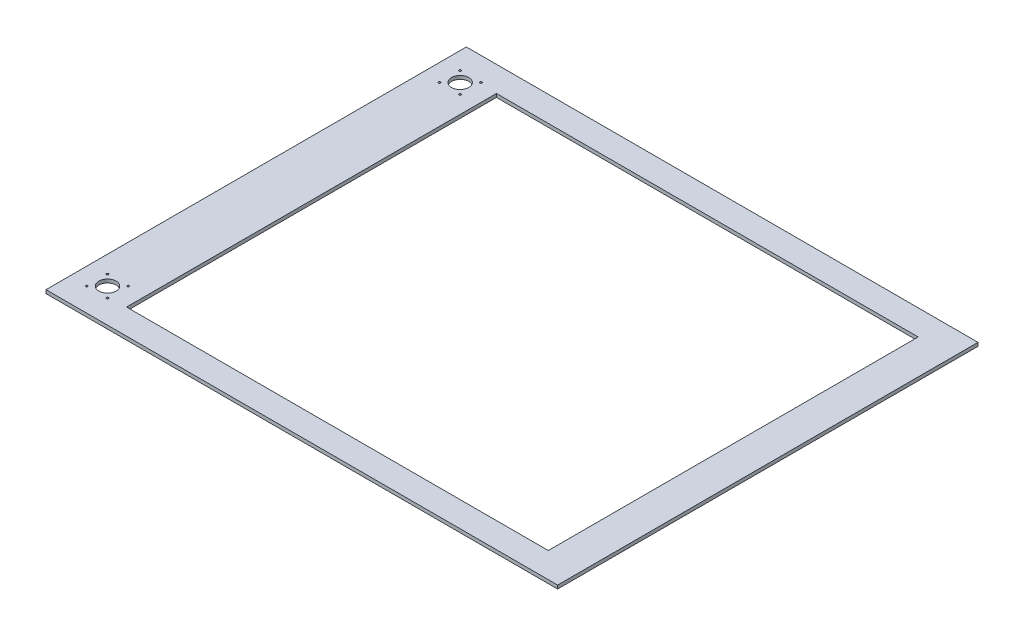
ISO-10303-21;
HEADER;
FILE_DESCRIPTION(('STEP AP214'),'2;1');
FILE_NAME('part.step','',(''),(''),'','','');
FILE_SCHEMA(('AUTOMOTIVE_DESIGN { 1 0 10303 214 1 1 1 1 }'));
ENDSEC;
DATA;
#1=APPLICATION_CONTEXT('core data for automotive mechanical design processes');
#2=APPLICATION_PROTOCOL_DEFINITION('international standard','automotive_design',2000,#1);
#3=PRODUCT_CONTEXT('',#1,'mechanical');
#4=PRODUCT('Part','Part','',(#3));
#5=PRODUCT_RELATED_PRODUCT_CATEGORY('part','',(#4));
#6=PRODUCT_DEFINITION_FORMATION('','',#4);
#7=PRODUCT_DEFINITION_CONTEXT('part definition',#1,'design');
#8=PRODUCT_DEFINITION('design','',#6,#7);
#9=PRODUCT_DEFINITION_SHAPE('','',#8);
#10=(LENGTH_UNIT() NAMED_UNIT(*) SI_UNIT(.MILLI.,.METRE.));
#11=(NAMED_UNIT(*) PLANE_ANGLE_UNIT() SI_UNIT($,.RADIAN.));
#12=(NAMED_UNIT(*) SI_UNIT($,.STERADIAN.) SOLID_ANGLE_UNIT());
#13=UNCERTAINTY_MEASURE_WITH_UNIT(LENGTH_MEASURE(1.E-05),#10,'distance_accuracy_value','');
#14=(GEOMETRIC_REPRESENTATION_CONTEXT(3) GLOBAL_UNCERTAINTY_ASSIGNED_CONTEXT((#13)) GLOBAL_UNIT_ASSIGNED_CONTEXT((#10,
#11,#12)) REPRESENTATION_CONTEXT('',''));
#15=CARTESIAN_POINT('',(0.,0.,0.));
#16=DIRECTION('',(0.,0.,1.));
#17=DIRECTION('',(1.,0.,0.));
#18=AXIS2_PLACEMENT_3D('',#15,#16,#17);
#19=CARTESIAN_POINT('',(0.,5.,0.));
#20=DIRECTION('',(0.,-1.,0.));
#21=DIRECTION('',(0.,0.,-1.));
#22=AXIS2_PLACEMENT_3D('',#19,#20,#21);
#23=PLANE('',#22);
#24=DIRECTION('',(0.,0.,1.));
#25=VECTOR('',#24,1.);
#26=CARTESIAN_POINT('',(0.,5.,0.));
#27=LINE('',#26,#25);
#28=CARTESIAN_POINT('',(-2.22044604925031E-13,5.,-608.));
#29=VERTEX_POINT('',#28);
#30=CARTESIAN_POINT('',(0.,5.,0.));
#31=VERTEX_POINT('',#30);
#32=EDGE_CURVE('E137',#29,#31,#27,.T.);
#33=ORIENTED_EDGE('',*,*,#32,.T.);
#34=DIRECTION('',(1.,0.,0.));
#35=VECTOR('',#34,1.);
#36=CARTESIAN_POINT('',(0.,5.,0.));
#37=LINE('',#36,#35);
#38=CARTESIAN_POINT('',(740.,5.,0.));
#39=VERTEX_POINT('',#38);
#40=EDGE_CURVE('E140',#31,#39,#37,.T.);
#41=ORIENTED_EDGE('',*,*,#40,.T.);
#42=DIRECTION('',(0.,0.,-1.));
#43=VECTOR('',#42,1.);
#44=CARTESIAN_POINT('',(740.,5.,0.));
#45=LINE('',#44,#43);
#46=CARTESIAN_POINT('',(740.,5.,-608.));
#47=VERTEX_POINT('',#46);
#48=EDGE_CURVE('E143',#39,#47,#45,.T.);
#49=ORIENTED_EDGE('',*,*,#48,.T.);
#50=DIRECTION('',(-1.,0.,0.));
#51=VECTOR('',#50,1.);
#52=CARTESIAN_POINT('',(-2.22044604925031E-13,5.,-608.));
#53=LINE('',#52,#51);
#54=EDGE_CURVE('E145',#47,#29,#53,.T.);
#55=ORIENTED_EDGE('',*,*,#54,.T.);
#56=EDGE_LOOP('',(#33,#41,#49,#55));
#57=FACE_BOUND('',#56,.T.);
#58=DIRECTION('',(0.,0.,1.));
#59=VECTOR('',#58,1.);
#60=CARTESIAN_POINT('',(80.,5.,-36.5));
#61=LINE('',#60,#59);
#62=CARTESIAN_POINT('',(80.,5.,-571.5));
#63=VERTEX_POINT('',#62);
#64=CARTESIAN_POINT('',(80.,5.,-36.5));
#65=VERTEX_POINT('',#64);
#66=EDGE_CURVE('E98',#63,#65,#61,.T.);
#67=ORIENTED_EDGE('',*,*,#66,.F.);
#68=DIRECTION('',(-1.,0.,0.));
#69=VECTOR('',#68,1.);
#70=CARTESIAN_POINT('',(80.,5.,-571.5));
#71=LINE('',#70,#69);
#72=CARTESIAN_POINT('',(690.,5.,-571.5));
#73=VERTEX_POINT('',#72);
#74=EDGE_CURVE('E121',#73,#63,#71,.T.);
#75=ORIENTED_EDGE('',*,*,#74,.F.);
#76=DIRECTION('',(0.,0.,-1.));
#77=VECTOR('',#76,1.);
#78=CARTESIAN_POINT('',(690.,5.,-36.5));
#79=LINE('',#78,#77);
#80=CARTESIAN_POINT('',(690.,5.,-36.5));
#81=VERTEX_POINT('',#80);
#82=EDGE_CURVE('E119',#81,#73,#79,.T.);
#83=ORIENTED_EDGE('',*,*,#82,.F.);
#84=DIRECTION('',(1.,0.,0.));
#85=VECTOR('',#84,1.);
#86=CARTESIAN_POINT('',(80.,5.,-36.5));
#87=LINE('',#86,#85);
#88=EDGE_CURVE('E106',#65,#81,#87,.T.);
#89=ORIENTED_EDGE('',*,*,#88,.F.);
#90=EDGE_LOOP('',(#67,#75,#83,#89));
#91=FACE_BOUND('',#90,.T.);
#92=CARTESIAN_POINT('',(40.,5.,-559.));
#93=DIRECTION('',(0.,1.,0.));
#94=DIRECTION('',(0.,0.,1.));
#95=AXIS2_PLACEMENT_3D('',#92,#93,#94);
#96=CIRCLE('',#95,12.5);
#97=CARTESIAN_POINT('',(40.,5.,-546.5));
#98=VERTEX_POINT('',#97);
#99=EDGE_CURVE('E127',#98,#98,#96,.T.);
#100=ORIENTED_EDGE('',*,*,#99,.F.);
#101=EDGE_LOOP('',(#100));
#102=FACE_BOUND('',#101,.T.);
#103=CARTESIAN_POINT('',(40.,5.,-49.));
#104=DIRECTION('',(0.,1.,0.));
#105=DIRECTION('',(0.,0.,1.));
#106=AXIS2_PLACEMENT_3D('',#103,#104,#105);
#107=CIRCLE('',#106,12.5);
#108=CARTESIAN_POINT('',(40.,5.,-36.5));
#109=VERTEX_POINT('',#108);
#110=EDGE_CURVE('E309',#109,#109,#107,.T.);
#111=ORIENTED_EDGE('',*,*,#110,.F.);
#112=EDGE_LOOP('',(#111));
#113=FACE_BOUND('',#112,.T.);
#114=CARTESIAN_POINT('',(25.,5.,-34.));
#115=DIRECTION('',(0.,1.,0.));
#116=DIRECTION('',(0.,0.,1.));
#117=AXIS2_PLACEMENT_3D('',#114,#115,#116);
#118=CIRCLE('',#117,1.50000000000001);
#119=CARTESIAN_POINT('',(25.,5.,-32.5));
#120=VERTEX_POINT('',#119);
#121=EDGE_CURVE('E303',#120,#120,#118,.T.);
#122=ORIENTED_EDGE('',*,*,#121,.F.);
#123=EDGE_LOOP('',(#122));
#124=FACE_BOUND('',#123,.T.);
#125=CARTESIAN_POINT('',(55.,5.,-34.));
#126=DIRECTION('',(0.,1.,0.));
#127=DIRECTION('',(0.,0.,1.));
#128=AXIS2_PLACEMENT_3D('',#125,#126,#127);
#129=CIRCLE('',#128,1.5);
#130=CARTESIAN_POINT('',(55.,5.,-32.5));
#131=VERTEX_POINT('',#130);
#132=EDGE_CURVE('E297',#131,#131,#129,.T.);
#133=ORIENTED_EDGE('',*,*,#132,.F.);
#134=EDGE_LOOP('',(#133));
#135=FACE_BOUND('',#134,.T.);
#136=CARTESIAN_POINT('',(25.,5.,-64.));
#137=DIRECTION('',(0.,1.,0.));
#138=DIRECTION('',(0.,0.,1.));
#139=AXIS2_PLACEMENT_3D('',#136,#137,#138);
#140=CIRCLE('',#139,1.5);
#141=CARTESIAN_POINT('',(25.,5.,-62.5));
#142=VERTEX_POINT('',#141);
#143=EDGE_CURVE('E291',#142,#142,#140,.T.);
#144=ORIENTED_EDGE('',*,*,#143,.F.);
#145=EDGE_LOOP('',(#144));
#146=FACE_BOUND('',#145,.T.);
#147=CARTESIAN_POINT('',(55.,5.,-64.));
#148=DIRECTION('',(0.,1.,0.));
#149=DIRECTION('',(0.,0.,1.));
#150=AXIS2_PLACEMENT_3D('',#147,#148,#149);
#151=CIRCLE('',#150,1.5);
#152=CARTESIAN_POINT('',(55.,5.,-62.5));
#153=VERTEX_POINT('',#152);
#154=EDGE_CURVE('E285',#153,#153,#151,.T.);
#155=ORIENTED_EDGE('',*,*,#154,.F.);
#156=EDGE_LOOP('',(#155));
#157=FACE_BOUND('',#156,.T.);
#158=CARTESIAN_POINT('',(55.,5.,-574.));
#159=DIRECTION('',(0.,1.,0.));
#160=DIRECTION('',(0.,0.,1.));
#161=AXIS2_PLACEMENT_3D('',#158,#159,#160);
#162=CIRCLE('',#161,1.5);
#163=CARTESIAN_POINT('',(55.,5.,-572.5));
#164=VERTEX_POINT('',#163);
#165=EDGE_CURVE('E279',#164,#164,#162,.T.);
#166=ORIENTED_EDGE('',*,*,#165,.F.);
#167=EDGE_LOOP('',(#166));
#168=FACE_BOUND('',#167,.T.);
#169=CARTESIAN_POINT('',(55.,5.,-544.));
#170=DIRECTION('',(0.,1.,0.));
#171=DIRECTION('',(0.,0.,1.));
#172=AXIS2_PLACEMENT_3D('',#169,#170,#171);
#173=CIRCLE('',#172,1.5);
#174=CARTESIAN_POINT('',(55.,5.,-542.5));
#175=VERTEX_POINT('',#174);
#176=EDGE_CURVE('E273',#175,#175,#173,.T.);
#177=ORIENTED_EDGE('',*,*,#176,.F.);
#178=EDGE_LOOP('',(#177));
#179=FACE_BOUND('',#178,.T.);
#180=CARTESIAN_POINT('',(25.,5.,-544.));
#181=DIRECTION('',(0.,1.,0.));
#182=DIRECTION('',(0.,0.,1.));
#183=AXIS2_PLACEMENT_3D('',#180,#181,#182);
#184=CIRCLE('',#183,1.5);
#185=CARTESIAN_POINT('',(25.,5.,-542.5));
#186=VERTEX_POINT('',#185);
#187=EDGE_CURVE('E267',#186,#186,#184,.T.);
#188=ORIENTED_EDGE('',*,*,#187,.F.);
#189=EDGE_LOOP('',(#188));
#190=FACE_BOUND('',#189,.T.);
#191=CARTESIAN_POINT('',(25.,5.,-574.));
#192=DIRECTION('',(0.,1.,0.));
#193=DIRECTION('',(0.,0.,1.));
#194=AXIS2_PLACEMENT_3D('',#191,#192,#193);
#195=CIRCLE('',#194,1.5);
#196=CARTESIAN_POINT('',(25.,5.,-572.5));
#197=VERTEX_POINT('',#196);
#198=EDGE_CURVE('E258',#197,#197,#195,.T.);
#199=ORIENTED_EDGE('',*,*,#198,.F.);
#200=EDGE_LOOP('',(#199));
#201=FACE_BOUND('',#200,.T.);
#202=ADVANCED_FACE('F33',(#57,#91,#102,#113,#124,#135,#146,#157,#168,#179,#190,#201),#23,.F.);
#203=CARTESIAN_POINT('',(0.,0.,0.));
#204=DIRECTION('',(0.,-1.,0.));
#205=DIRECTION('',(0.,0.,-1.));
#206=AXIS2_PLACEMENT_3D('',#203,#204,#205);
#207=PLANE('',#206);
#208=CARTESIAN_POINT('',(25.,0.,-544.));
#209=DIRECTION('',(0.,1.,0.));
#210=DIRECTION('',(0.,0.,1.));
#211=AXIS2_PLACEMENT_3D('',#208,#209,#210);
#212=CIRCLE('',#211,1.5);
#213=CARTESIAN_POINT('',(25.,0.,-542.5));
#214=VERTEX_POINT('',#213);
#215=EDGE_CURVE('E264',#214,#214,#212,.T.);
#216=ORIENTED_EDGE('',*,*,#215,.T.);
#217=EDGE_LOOP('',(#216));
#218=FACE_BOUND('',#217,.T.);
#219=CARTESIAN_POINT('',(55.,0.,-574.));
#220=DIRECTION('',(0.,1.,0.));
#221=DIRECTION('',(0.,0.,1.));
#222=AXIS2_PLACEMENT_3D('',#219,#220,#221);
#223=CIRCLE('',#222,1.5);
#224=CARTESIAN_POINT('',(55.,0.,-572.5));
#225=VERTEX_POINT('',#224);
#226=EDGE_CURVE('E276',#225,#225,#223,.T.);
#227=ORIENTED_EDGE('',*,*,#226,.T.);
#228=EDGE_LOOP('',(#227));
#229=FACE_BOUND('',#228,.T.);
#230=CARTESIAN_POINT('',(25.,0.,-64.));
#231=DIRECTION('',(0.,1.,0.));
#232=DIRECTION('',(0.,0.,1.));
#233=AXIS2_PLACEMENT_3D('',#230,#231,#232);
#234=CIRCLE('',#233,1.5);
#235=CARTESIAN_POINT('',(25.,0.,-62.5));
#236=VERTEX_POINT('',#235);
#237=EDGE_CURVE('E288',#236,#236,#234,.T.);
#238=ORIENTED_EDGE('',*,*,#237,.T.);
#239=EDGE_LOOP('',(#238));
#240=FACE_BOUND('',#239,.T.);
#241=CARTESIAN_POINT('',(25.,0.,-34.));
#242=DIRECTION('',(0.,1.,0.));
#243=DIRECTION('',(0.,0.,1.));
#244=AXIS2_PLACEMENT_3D('',#241,#242,#243);
#245=CIRCLE('',#244,1.50000000000001);
#246=CARTESIAN_POINT('',(25.,0.,-32.5));
#247=VERTEX_POINT('',#246);
#248=EDGE_CURVE('E300',#247,#247,#245,.T.);
#249=ORIENTED_EDGE('',*,*,#248,.T.);
#250=EDGE_LOOP('',(#249));
#251=FACE_BOUND('',#250,.T.);
#252=CARTESIAN_POINT('',(40.,0.,-559.));
#253=DIRECTION('',(0.,1.,0.));
#254=DIRECTION('',(0.,0.,1.));
#255=AXIS2_PLACEMENT_3D('',#252,#253,#254);
#256=CIRCLE('',#255,12.5);
#257=CARTESIAN_POINT('',(40.,0.,-546.5));
#258=VERTEX_POINT('',#257);
#259=EDGE_CURVE('E312',#258,#258,#256,.T.);
#260=ORIENTED_EDGE('',*,*,#259,.T.);
#261=EDGE_LOOP('',(#260));
#262=FACE_BOUND('',#261,.T.);
#263=DIRECTION('',(0.,0.,1.));
#264=VECTOR('',#263,1.);
#265=CARTESIAN_POINT('',(0.,0.,0.));
#266=LINE('',#265,#264);
#267=CARTESIAN_POINT('',(-2.22044604925031E-13,0.,-608.));
#268=VERTEX_POINT('',#267);
#269=CARTESIAN_POINT('',(0.,0.,0.));
#270=VERTEX_POINT('',#269);
#271=EDGE_CURVE('E114',#268,#270,#266,.T.);
#272=ORIENTED_EDGE('',*,*,#271,.F.);
#273=DIRECTION('',(-1.,0.,0.));
#274=VECTOR('',#273,1.);
#275=CARTESIAN_POINT('',(-2.22044604925031E-13,0.,-608.));
#276=LINE('',#275,#274);
#277=CARTESIAN_POINT('',(740.,0.,-608.));
#278=VERTEX_POINT('',#277);
#279=EDGE_CURVE('E141',#278,#268,#276,.T.);
#280=ORIENTED_EDGE('',*,*,#279,.F.);
#281=DIRECTION('',(0.,0.,-1.));
#282=VECTOR('',#281,1.);
#283=CARTESIAN_POINT('',(740.,0.,0.));
#284=LINE('',#283,#282);
#285=CARTESIAN_POINT('',(740.,0.,0.));
#286=VERTEX_POINT('',#285);
#287=EDGE_CURVE('E152',#286,#278,#284,.T.);
#288=ORIENTED_EDGE('',*,*,#287,.F.);
#289=DIRECTION('',(1.,0.,0.));
#290=VECTOR('',#289,1.);
#291=CARTESIAN_POINT('',(0.,0.,0.));
#292=LINE('',#291,#290);
#293=EDGE_CURVE('E150',#270,#286,#292,.T.);
#294=ORIENTED_EDGE('',*,*,#293,.F.);
#295=EDGE_LOOP('',(#272,#280,#288,#294));
#296=FACE_BOUND('',#295,.T.);
#297=DIRECTION('',(-1.,0.,0.));
#298=VECTOR('',#297,1.);
#299=CARTESIAN_POINT('',(80.,0.,-571.5));
#300=LINE('',#299,#298);
#301=CARTESIAN_POINT('',(690.,0.,-571.5));
#302=VERTEX_POINT('',#301);
#303=CARTESIAN_POINT('',(80.,0.,-571.5));
#304=VERTEX_POINT('',#303);
#305=EDGE_CURVE('E107',#302,#304,#300,.T.);
#306=ORIENTED_EDGE('',*,*,#305,.T.);
#307=DIRECTION('',(0.,0.,1.));
#308=VECTOR('',#307,1.);
#309=CARTESIAN_POINT('',(80.,0.,-36.5));
#310=LINE('',#309,#308);
#311=CARTESIAN_POINT('',(80.,0.,-36.5));
#312=VERTEX_POINT('',#311);
#313=EDGE_CURVE('E56',#304,#312,#310,.T.);
#314=ORIENTED_EDGE('',*,*,#313,.T.);
#315=DIRECTION('',(1.,0.,0.));
#316=VECTOR('',#315,1.);
#317=CARTESIAN_POINT('',(80.,0.,-36.5));
#318=LINE('',#317,#316);
#319=CARTESIAN_POINT('',(690.,0.,-36.5));
#320=VERTEX_POINT('',#319);
#321=EDGE_CURVE('E113',#312,#320,#318,.T.);
#322=ORIENTED_EDGE('',*,*,#321,.T.);
#323=DIRECTION('',(0.,0.,-1.));
#324=VECTOR('',#323,1.);
#325=CARTESIAN_POINT('',(690.,0.,-36.5));
#326=LINE('',#325,#324);
#327=EDGE_CURVE('E129',#320,#302,#326,.T.);
#328=ORIENTED_EDGE('',*,*,#327,.T.);
#329=EDGE_LOOP('',(#306,#314,#322,#328));
#330=FACE_BOUND('',#329,.T.);
#331=CARTESIAN_POINT('',(40.,0.,-49.));
#332=DIRECTION('',(0.,1.,0.));
#333=DIRECTION('',(0.,0.,1.));
#334=AXIS2_PLACEMENT_3D('',#331,#332,#333);
#335=CIRCLE('',#334,12.5);
#336=CARTESIAN_POINT('',(40.,0.,-36.5));
#337=VERTEX_POINT('',#336);
#338=EDGE_CURVE('E306',#337,#337,#335,.T.);
#339=ORIENTED_EDGE('',*,*,#338,.T.);
#340=EDGE_LOOP('',(#339));
#341=FACE_BOUND('',#340,.T.);
#342=CARTESIAN_POINT('',(55.,0.,-34.));
#343=DIRECTION('',(0.,1.,0.));
#344=DIRECTION('',(0.,0.,1.));
#345=AXIS2_PLACEMENT_3D('',#342,#343,#344);
#346=CIRCLE('',#345,1.5);
#347=CARTESIAN_POINT('',(55.,0.,-32.5));
#348=VERTEX_POINT('',#347);
#349=EDGE_CURVE('E294',#348,#348,#346,.T.);
#350=ORIENTED_EDGE('',*,*,#349,.T.);
#351=EDGE_LOOP('',(#350));
#352=FACE_BOUND('',#351,.T.);
#353=CARTESIAN_POINT('',(55.,0.,-64.));
#354=DIRECTION('',(0.,1.,0.));
#355=DIRECTION('',(0.,0.,1.));
#356=AXIS2_PLACEMENT_3D('',#353,#354,#355);
#357=CIRCLE('',#356,1.5);
#358=CARTESIAN_POINT('',(55.,0.,-62.5));
#359=VERTEX_POINT('',#358);
#360=EDGE_CURVE('E282',#359,#359,#357,.T.);
#361=ORIENTED_EDGE('',*,*,#360,.T.);
#362=EDGE_LOOP('',(#361));
#363=FACE_BOUND('',#362,.T.);
#364=CARTESIAN_POINT('',(55.,0.,-544.));
#365=DIRECTION('',(0.,1.,0.));
#366=DIRECTION('',(0.,0.,1.));
#367=AXIS2_PLACEMENT_3D('',#364,#365,#366);
#368=CIRCLE('',#367,1.5);
#369=CARTESIAN_POINT('',(55.,0.,-542.5));
#370=VERTEX_POINT('',#369);
#371=EDGE_CURVE('E270',#370,#370,#368,.T.);
#372=ORIENTED_EDGE('',*,*,#371,.T.);
#373=EDGE_LOOP('',(#372));
#374=FACE_BOUND('',#373,.T.);
#375=CARTESIAN_POINT('',(25.,0.,-574.));
#376=DIRECTION('',(0.,1.,0.));
#377=DIRECTION('',(0.,0.,1.));
#378=AXIS2_PLACEMENT_3D('',#375,#376,#377);
#379=CIRCLE('',#378,1.5);
#380=CARTESIAN_POINT('',(25.,0.,-572.5));
#381=VERTEX_POINT('',#380);
#382=EDGE_CURVE('E261',#381,#381,#379,.T.);
#383=ORIENTED_EDGE('',*,*,#382,.T.);
#384=EDGE_LOOP('',(#383));
#385=FACE_BOUND('',#384,.T.);
#386=ADVANCED_FACE('F170',(#218,#229,#240,#251,#262,#296,#330,#341,#352,#363,#374,#385),#207,.T.);
#387=CARTESIAN_POINT('',(0.,5.,0.));
#388=DIRECTION('',(1.,0.,0.));
#389=DIRECTION('',(0.,0.,-1.));
#390=AXIS2_PLACEMENT_3D('',#387,#388,#389);
#391=PLANE('',#390);
#392=ORIENTED_EDGE('',*,*,#271,.T.);
#393=DIRECTION('',(0.,-1.,0.));
#394=VECTOR('',#393,1.);
#395=CARTESIAN_POINT('',(0.,5.,0.));
#396=LINE('',#395,#394);
#397=EDGE_CURVE('E11',#31,#270,#396,.T.);
#398=ORIENTED_EDGE('',*,*,#397,.F.);
#399=ORIENTED_EDGE('',*,*,#32,.F.);
#400=DIRECTION('',(0.,-1.,0.));
#401=VECTOR('',#400,1.);
#402=CARTESIAN_POINT('',(-2.22044604925031E-13,5.,-608.));
#403=LINE('',#402,#401);
#404=EDGE_CURVE('E147',#29,#268,#403,.T.);
#405=ORIENTED_EDGE('',*,*,#404,.T.);
#406=EDGE_LOOP('',(#392,#398,#399,#405));
#407=FACE_BOUND('',#406,.T.);
#408=ADVANCED_FACE('F35',(#407),#391,.F.);
#409=CARTESIAN_POINT('',(0.,5.,0.));
#410=DIRECTION('',(0.,0.,-1.));
#411=DIRECTION('',(-1.,0.,0.));
#412=AXIS2_PLACEMENT_3D('',#409,#410,#411);
#413=PLANE('',#412);
#414=ORIENTED_EDGE('',*,*,#293,.T.);
#415=DIRECTION('',(0.,-1.,0.));
#416=VECTOR('',#415,1.);
#417=CARTESIAN_POINT('',(740.,5.,0.));
#418=LINE('',#417,#416);
#419=EDGE_CURVE('E41',#39,#286,#418,.T.);
#420=ORIENTED_EDGE('',*,*,#419,.F.);
#421=ORIENTED_EDGE('',*,*,#40,.F.);
#422=ORIENTED_EDGE('',*,*,#397,.T.);
#423=EDGE_LOOP('',(#414,#420,#421,#422));
#424=FACE_BOUND('',#423,.T.);
#425=ADVANCED_FACE('F180',(#424),#413,.F.);
#426=CARTESIAN_POINT('',(740.,5.,0.));
#427=DIRECTION('',(-1.,0.,0.));
#428=DIRECTION('',(0.,0.,1.));
#429=AXIS2_PLACEMENT_3D('',#426,#427,#428);
#430=PLANE('',#429);
#431=ORIENTED_EDGE('',*,*,#287,.T.);
#432=DIRECTION('',(0.,-1.,0.));
#433=VECTOR('',#432,1.);
#434=CARTESIAN_POINT('',(740.,5.,-608.));
#435=LINE('',#434,#433);
#436=EDGE_CURVE('E157',#47,#278,#435,.T.);
#437=ORIENTED_EDGE('',*,*,#436,.F.);
#438=ORIENTED_EDGE('',*,*,#48,.F.);
#439=ORIENTED_EDGE('',*,*,#419,.T.);
#440=EDGE_LOOP('',(#431,#437,#438,#439));
#441=FACE_BOUND('',#440,.T.);
#442=ADVANCED_FACE('F164',(#441),#430,.F.);
#443=CARTESIAN_POINT('',(-2.22044604925031E-13,5.,-608.));
#444=DIRECTION('',(0.,0.,1.));
#445=DIRECTION('',(1.,0.,0.));
#446=AXIS2_PLACEMENT_3D('',#443,#444,#445);
#447=PLANE('',#446);
#448=ORIENTED_EDGE('',*,*,#279,.T.);
#449=ORIENTED_EDGE('',*,*,#404,.F.);
#450=ORIENTED_EDGE('',*,*,#54,.F.);
#451=ORIENTED_EDGE('',*,*,#436,.T.);
#452=EDGE_LOOP('',(#448,#449,#450,#451));
#453=FACE_BOUND('',#452,.T.);
#454=ADVANCED_FACE('F174',(#453),#447,.F.);
#455=CARTESIAN_POINT('',(80.,5.,-36.5));
#456=DIRECTION('',(1.,0.,0.));
#457=DIRECTION('',(0.,0.,-1.));
#458=AXIS2_PLACEMENT_3D('',#455,#456,#457);
#459=PLANE('',#458);
#460=ORIENTED_EDGE('',*,*,#313,.F.);
#461=DIRECTION('',(0.,-1.,0.));
#462=VECTOR('',#461,1.);
#463=CARTESIAN_POINT('',(80.,5.,-571.5));
#464=LINE('',#463,#462);
#465=EDGE_CURVE('E102',#63,#304,#464,.T.);
#466=ORIENTED_EDGE('',*,*,#465,.F.);
#467=ORIENTED_EDGE('',*,*,#66,.T.);
#468=DIRECTION('',(0.,-1.,0.));
#469=VECTOR('',#468,1.);
#470=CARTESIAN_POINT('',(80.,5.,-36.5));
#471=LINE('',#470,#469);
#472=EDGE_CURVE('E101',#65,#312,#471,.T.);
#473=ORIENTED_EDGE('',*,*,#472,.T.);
#474=EDGE_LOOP('',(#460,#466,#467,#473));
#475=FACE_BOUND('',#474,.T.);
#476=ADVANCED_FACE('F100',(#475),#459,.T.);
#477=CARTESIAN_POINT('',(80.,5.,-36.5));
#478=DIRECTION('',(0.,0.,-1.));
#479=DIRECTION('',(-1.,0.,0.));
#480=AXIS2_PLACEMENT_3D('',#477,#478,#479);
#481=PLANE('',#480);
#482=ORIENTED_EDGE('',*,*,#321,.F.);
#483=ORIENTED_EDGE('',*,*,#472,.F.);
#484=ORIENTED_EDGE('',*,*,#88,.T.);
#485=DIRECTION('',(0.,-1.,0.));
#486=VECTOR('',#485,1.);
#487=CARTESIAN_POINT('',(690.,5.,-36.5));
#488=LINE('',#487,#486);
#489=EDGE_CURVE('E115',#81,#320,#488,.T.);
#490=ORIENTED_EDGE('',*,*,#489,.T.);
#491=EDGE_LOOP('',(#482,#483,#484,#490));
#492=FACE_BOUND('',#491,.T.);
#493=ADVANCED_FACE('F110',(#492),#481,.T.);
#494=CARTESIAN_POINT('',(690.,5.,-36.5));
#495=DIRECTION('',(-1.,0.,0.));
#496=DIRECTION('',(0.,0.,1.));
#497=AXIS2_PLACEMENT_3D('',#494,#495,#496);
#498=PLANE('',#497);
#499=ORIENTED_EDGE('',*,*,#327,.F.);
#500=ORIENTED_EDGE('',*,*,#489,.F.);
#501=ORIENTED_EDGE('',*,*,#82,.T.);
#502=DIRECTION('',(0.,-1.,0.));
#503=VECTOR('',#502,1.);
#504=CARTESIAN_POINT('',(690.,5.,-571.5));
#505=LINE('',#504,#503);
#506=EDGE_CURVE('E48',#73,#302,#505,.T.);
#507=ORIENTED_EDGE('',*,*,#506,.T.);
#508=EDGE_LOOP('',(#499,#500,#501,#507));
#509=FACE_BOUND('',#508,.T.);
#510=ADVANCED_FACE('F204',(#509),#498,.T.);
#511=CARTESIAN_POINT('',(80.,5.,-571.5));
#512=DIRECTION('',(0.,0.,1.));
#513=DIRECTION('',(1.,0.,0.));
#514=AXIS2_PLACEMENT_3D('',#511,#512,#513);
#515=PLANE('',#514);
#516=ORIENTED_EDGE('',*,*,#305,.F.);
#517=ORIENTED_EDGE('',*,*,#506,.F.);
#518=ORIENTED_EDGE('',*,*,#74,.T.);
#519=ORIENTED_EDGE('',*,*,#465,.T.);
#520=EDGE_LOOP('',(#516,#517,#518,#519));
#521=FACE_BOUND('',#520,.T.);
#522=ADVANCED_FACE('F208',(#521),#515,.T.);
#523=CARTESIAN_POINT('',(40.,5.,-559.));
#524=DIRECTION('',(0.,-1.,0.));
#525=DIRECTION('',(0.,0.,-1.));
#526=AXIS2_PLACEMENT_3D('',#523,#524,#525);
#527=CYLINDRICAL_SURFACE('',#526,12.5);
#528=ORIENTED_EDGE('',*,*,#99,.T.);
#529=EDGE_LOOP('',(#528));
#530=FACE_BOUND('',#529,.T.);
#531=ORIENTED_EDGE('',*,*,#259,.F.);
#532=EDGE_LOOP('',(#531));
#533=FACE_BOUND('',#532,.T.);
#534=ADVANCED_FACE('F214',(#530,#533),#527,.F.);
#535=CARTESIAN_POINT('',(40.,5.,-49.));
#536=DIRECTION('',(0.,-1.,0.));
#537=DIRECTION('',(0.,0.,-1.));
#538=AXIS2_PLACEMENT_3D('',#535,#536,#537);
#539=CYLINDRICAL_SURFACE('',#538,12.5);
#540=ORIENTED_EDGE('',*,*,#110,.T.);
#541=EDGE_LOOP('',(#540));
#542=FACE_BOUND('',#541,.T.);
#543=ORIENTED_EDGE('',*,*,#338,.F.);
#544=EDGE_LOOP('',(#543));
#545=FACE_BOUND('',#544,.T.);
#546=ADVANCED_FACE('F217',(#542,#545),#539,.F.);
#547=CARTESIAN_POINT('',(25.,5.,-34.));
#548=DIRECTION('',(0.,-1.,0.));
#549=DIRECTION('',(0.,0.,-1.));
#550=AXIS2_PLACEMENT_3D('',#547,#548,#549);
#551=CYLINDRICAL_SURFACE('',#550,1.50000000000001);
#552=ORIENTED_EDGE('',*,*,#121,.T.);
#553=EDGE_LOOP('',(#552));
#554=FACE_BOUND('',#553,.T.);
#555=ORIENTED_EDGE('',*,*,#248,.F.);
#556=EDGE_LOOP('',(#555));
#557=FACE_BOUND('',#556,.T.);
#558=ADVANCED_FACE('F221',(#554,#557),#551,.F.);
#559=CARTESIAN_POINT('',(55.,5.,-34.));
#560=DIRECTION('',(0.,-1.,0.));
#561=DIRECTION('',(0.,0.,-1.));
#562=AXIS2_PLACEMENT_3D('',#559,#560,#561);
#563=CYLINDRICAL_SURFACE('',#562,1.5);
#564=ORIENTED_EDGE('',*,*,#132,.T.);
#565=EDGE_LOOP('',(#564));
#566=FACE_BOUND('',#565,.T.);
#567=ORIENTED_EDGE('',*,*,#349,.F.);
#568=EDGE_LOOP('',(#567));
#569=FACE_BOUND('',#568,.T.);
#570=ADVANCED_FACE('F225',(#566,#569),#563,.F.);
#571=CARTESIAN_POINT('',(25.,5.,-64.));
#572=DIRECTION('',(0.,-1.,0.));
#573=DIRECTION('',(0.,0.,-1.));
#574=AXIS2_PLACEMENT_3D('',#571,#572,#573);
#575=CYLINDRICAL_SURFACE('',#574,1.5);
#576=ORIENTED_EDGE('',*,*,#143,.T.);
#577=EDGE_LOOP('',(#576));
#578=FACE_BOUND('',#577,.T.);
#579=ORIENTED_EDGE('',*,*,#237,.F.);
#580=EDGE_LOOP('',(#579));
#581=FACE_BOUND('',#580,.T.);
#582=ADVANCED_FACE('F229',(#578,#581),#575,.F.);
#583=CARTESIAN_POINT('',(55.,5.,-64.));
#584=DIRECTION('',(0.,-1.,0.));
#585=DIRECTION('',(0.,0.,-1.));
#586=AXIS2_PLACEMENT_3D('',#583,#584,#585);
#587=CYLINDRICAL_SURFACE('',#586,1.5);
#588=ORIENTED_EDGE('',*,*,#154,.T.);
#589=EDGE_LOOP('',(#588));
#590=FACE_BOUND('',#589,.T.);
#591=ORIENTED_EDGE('',*,*,#360,.F.);
#592=EDGE_LOOP('',(#591));
#593=FACE_BOUND('',#592,.T.);
#594=ADVANCED_FACE('F233',(#590,#593),#587,.F.);
#595=CARTESIAN_POINT('',(55.,5.,-574.));
#596=DIRECTION('',(0.,-1.,0.));
#597=DIRECTION('',(0.,0.,-1.));
#598=AXIS2_PLACEMENT_3D('',#595,#596,#597);
#599=CYLINDRICAL_SURFACE('',#598,1.5);
#600=ORIENTED_EDGE('',*,*,#165,.T.);
#601=EDGE_LOOP('',(#600));
#602=FACE_BOUND('',#601,.T.);
#603=ORIENTED_EDGE('',*,*,#226,.F.);
#604=EDGE_LOOP('',(#603));
#605=FACE_BOUND('',#604,.T.);
#606=ADVANCED_FACE('F237',(#602,#605),#599,.F.);
#607=CARTESIAN_POINT('',(55.,5.,-544.));
#608=DIRECTION('',(0.,-1.,0.));
#609=DIRECTION('',(0.,0.,-1.));
#610=AXIS2_PLACEMENT_3D('',#607,#608,#609);
#611=CYLINDRICAL_SURFACE('',#610,1.5);
#612=ORIENTED_EDGE('',*,*,#176,.T.);
#613=EDGE_LOOP('',(#612));
#614=FACE_BOUND('',#613,.T.);
#615=ORIENTED_EDGE('',*,*,#371,.F.);
#616=EDGE_LOOP('',(#615));
#617=FACE_BOUND('',#616,.T.);
#618=ADVANCED_FACE('F241',(#614,#617),#611,.F.);
#619=CARTESIAN_POINT('',(25.,5.,-544.));
#620=DIRECTION('',(0.,-1.,0.));
#621=DIRECTION('',(0.,0.,-1.));
#622=AXIS2_PLACEMENT_3D('',#619,#620,#621);
#623=CYLINDRICAL_SURFACE('',#622,1.5);
#624=ORIENTED_EDGE('',*,*,#187,.T.);
#625=EDGE_LOOP('',(#624));
#626=FACE_BOUND('',#625,.T.);
#627=ORIENTED_EDGE('',*,*,#215,.F.);
#628=EDGE_LOOP('',(#627));
#629=FACE_BOUND('',#628,.T.);
#630=ADVANCED_FACE('F245',(#626,#629),#623,.F.);
#631=CARTESIAN_POINT('',(25.,5.,-574.));
#632=DIRECTION('',(0.,-1.,0.));
#633=DIRECTION('',(0.,0.,-1.));
#634=AXIS2_PLACEMENT_3D('',#631,#632,#633);
#635=CYLINDRICAL_SURFACE('',#634,1.5);
#636=ORIENTED_EDGE('',*,*,#198,.T.);
#637=EDGE_LOOP('',(#636));
#638=FACE_BOUND('',#637,.T.);
#639=ORIENTED_EDGE('',*,*,#382,.F.);
#640=EDGE_LOOP('',(#639));
#641=FACE_BOUND('',#640,.T.);
#642=ADVANCED_FACE('F249',(#638,#641),#635,.F.);
#643=CLOSED_SHELL('',(#202,#386,#408,#425,#442,#454,#476,#493,#510,#522,#534,#546,#558,#570,
#582,#594,#606,#618,#630,#642));
#644=MANIFOLD_SOLID_BREP('B2',#643);
#645=ADVANCED_BREP_SHAPE_REPRESENTATION('',(#18,#644),#14);
#646=SHAPE_DEFINITION_REPRESENTATION(#9,#645);
ENDSEC;
END-ISO-10303-21;
